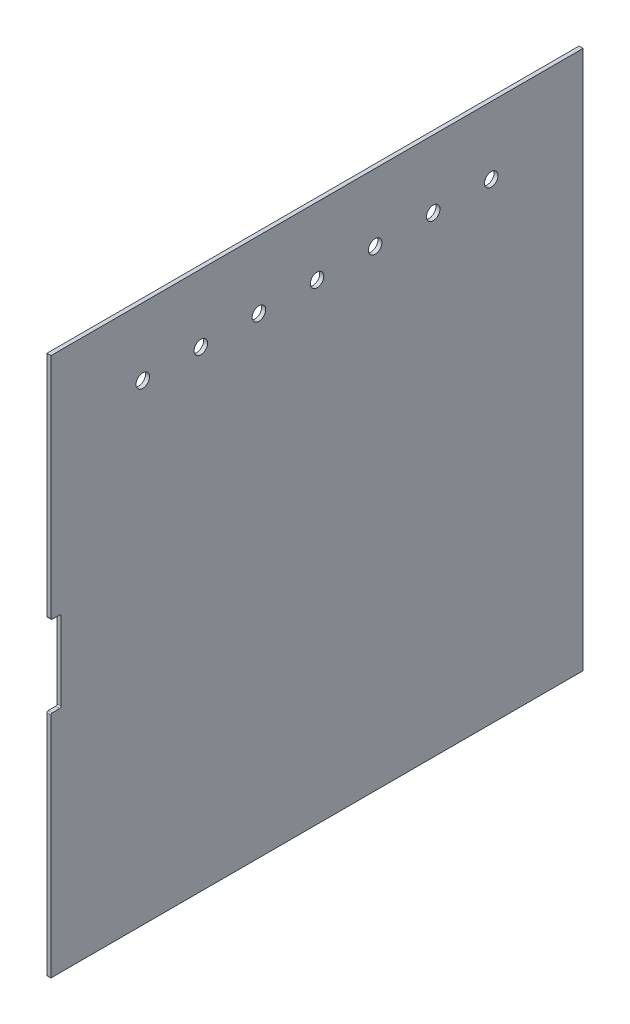
ISO-10303-21;
HEADER;
FILE_DESCRIPTION(('STEP AP214'),'2;1');
FILE_NAME('part.step','',(''),(''),'','','');
FILE_SCHEMA(('AUTOMOTIVE_DESIGN { 1 0 10303 214 1 1 1 1 }'));
ENDSEC;
DATA;
#1=APPLICATION_CONTEXT('core data for automotive mechanical design processes');
#2=APPLICATION_PROTOCOL_DEFINITION('international standard','automotive_design',2000,#1);
#3=PRODUCT_CONTEXT('',#1,'mechanical');
#4=PRODUCT('Part','Part','',(#3));
#5=PRODUCT_RELATED_PRODUCT_CATEGORY('part','',(#4));
#6=PRODUCT_DEFINITION_FORMATION('','',#4);
#7=PRODUCT_DEFINITION_CONTEXT('part definition',#1,'design');
#8=PRODUCT_DEFINITION('design','',#6,#7);
#9=PRODUCT_DEFINITION_SHAPE('','',#8);
#10=(LENGTH_UNIT() NAMED_UNIT(*) SI_UNIT(.MILLI.,.METRE.));
#11=(NAMED_UNIT(*) PLANE_ANGLE_UNIT() SI_UNIT($,.RADIAN.));
#12=(NAMED_UNIT(*) SI_UNIT($,.STERADIAN.) SOLID_ANGLE_UNIT());
#13=UNCERTAINTY_MEASURE_WITH_UNIT(LENGTH_MEASURE(1.E-05),#10,'distance_accuracy_value','');
#14=(GEOMETRIC_REPRESENTATION_CONTEXT(3) GLOBAL_UNCERTAINTY_ASSIGNED_CONTEXT((#13)) GLOBAL_UNIT_ASSIGNED_CONTEXT((#10,
#11,#12)) REPRESENTATION_CONTEXT('',''));
#15=CARTESIAN_POINT('',(0.,0.,0.));
#16=DIRECTION('',(0.,0.,1.));
#17=DIRECTION('',(1.,0.,0.));
#18=AXIS2_PLACEMENT_3D('',#15,#16,#17);
#19=CARTESIAN_POINT('',(3.,199.5,197.));
#20=DIRECTION('',(0.,0.,-1.));
#21=DIRECTION('',(0.,1.,0.));
#22=AXIS2_PLACEMENT_3D('',#19,#20,#21);
#23=PLANE('',#22);
#24=DIRECTION('',(0.,-1.,0.));
#25=VECTOR('',#24,1.);
#26=CARTESIAN_POINT('',(0.,199.5,197.));
#27=LINE('',#26,#25);
#28=CARTESIAN_POINT('',(0.,199.5,197.));
#29=VERTEX_POINT('',#28);
#30=CARTESIAN_POINT('',(0.,31.,197.));
#31=VERTEX_POINT('',#30);
#32=EDGE_CURVE('E313',#29,#31,#27,.T.);
#33=ORIENTED_EDGE('',*,*,#32,.T.);
#34=DIRECTION('',(1.,0.,0.));
#35=VECTOR('',#34,1.);
#36=CARTESIAN_POINT('',(3.,31.,197.));
#37=LINE('',#36,#35);
#38=CARTESIAN_POINT('',(3.,31.,197.));
#39=VERTEX_POINT('',#38);
#40=EDGE_CURVE('E195',#31,#39,#37,.T.);
#41=ORIENTED_EDGE('',*,*,#40,.T.);
#42=DIRECTION('',(0.,-1.,0.));
#43=VECTOR('',#42,1.);
#44=CARTESIAN_POINT('',(3.,199.5,197.));
#45=LINE('',#44,#43);
#46=CARTESIAN_POINT('',(3.,199.5,197.));
#47=VERTEX_POINT('',#46);
#48=EDGE_CURVE('E304',#47,#39,#45,.T.);
#49=ORIENTED_EDGE('',*,*,#48,.F.);
#50=DIRECTION('',(-1.,0.,0.));
#51=VECTOR('',#50,1.);
#52=CARTESIAN_POINT('',(3.,199.5,197.));
#53=LINE('',#52,#51);
#54=EDGE_CURVE('E137',#47,#29,#53,.T.);
#55=ORIENTED_EDGE('',*,*,#54,.T.);
#56=EDGE_LOOP('',(#33,#41,#49,#55));
#57=FACE_BOUND('',#56,.T.);
#58=ADVANCED_FACE('F38',(#57),#23,.F.);
#59=CARTESIAN_POINT('',(3.,199.5,-197.));
#60=DIRECTION('',(0.,0.,1.));
#61=DIRECTION('',(0.,-1.,0.));
#62=AXIS2_PLACEMENT_3D('',#59,#60,#61);
#63=PLANE('',#62);
#64=DIRECTION('',(0.,1.,0.));
#65=VECTOR('',#64,1.);
#66=CARTESIAN_POINT('',(0.,199.5,-197.));
#67=LINE('',#66,#65);
#68=CARTESIAN_POINT('',(0.,-199.5,-197.));
#69=VERTEX_POINT('',#68);
#70=CARTESIAN_POINT('',(0.,199.5,-197.));
#71=VERTEX_POINT('',#70);
#72=EDGE_CURVE('E159',#69,#71,#67,.T.);
#73=ORIENTED_EDGE('',*,*,#72,.T.);
#74=DIRECTION('',(-1.,0.,0.));
#75=VECTOR('',#74,1.);
#76=CARTESIAN_POINT('',(3.,199.5,-197.));
#77=LINE('',#76,#75);
#78=CARTESIAN_POINT('',(3.,199.5,-197.));
#79=VERTEX_POINT('',#78);
#80=EDGE_CURVE('E134',#79,#71,#77,.T.);
#81=ORIENTED_EDGE('',*,*,#80,.F.);
#82=DIRECTION('',(0.,1.,0.));
#83=VECTOR('',#82,1.);
#84=CARTESIAN_POINT('',(3.,199.5,-197.));
#85=LINE('',#84,#83);
#86=CARTESIAN_POINT('',(3.,-199.5,-197.));
#87=VERTEX_POINT('',#86);
#88=EDGE_CURVE('E143',#87,#79,#85,.T.);
#89=ORIENTED_EDGE('',*,*,#88,.F.);
#90=DIRECTION('',(-1.,0.,0.));
#91=VECTOR('',#90,1.);
#92=CARTESIAN_POINT('',(3.,-199.5,-197.));
#93=LINE('',#92,#91);
#94=EDGE_CURVE('E308',#87,#69,#93,.T.);
#95=ORIENTED_EDGE('',*,*,#94,.T.);
#96=EDGE_LOOP('',(#73,#81,#89,#95));
#97=FACE_BOUND('',#96,.T.);
#98=ADVANCED_FACE('F157',(#97),#63,.F.);
#99=CARTESIAN_POINT('',(3.,199.5,197.));
#100=DIRECTION('',(0.,-1.,0.));
#101=DIRECTION('',(0.,0.,-1.));
#102=AXIS2_PLACEMENT_3D('',#99,#100,#101);
#103=PLANE('',#102);
#104=DIRECTION('',(0.,0.,1.));
#105=VECTOR('',#104,1.);
#106=CARTESIAN_POINT('',(0.,199.5,197.));
#107=LINE('',#106,#105);
#108=EDGE_CURVE('E237',#71,#29,#107,.T.);
#109=ORIENTED_EDGE('',*,*,#108,.T.);
#110=ORIENTED_EDGE('',*,*,#54,.F.);
#111=DIRECTION('',(0.,0.,1.));
#112=VECTOR('',#111,1.);
#113=CARTESIAN_POINT('',(3.,199.5,197.));
#114=LINE('',#113,#112);
#115=EDGE_CURVE('E130',#79,#47,#114,.T.);
#116=ORIENTED_EDGE('',*,*,#115,.F.);
#117=ORIENTED_EDGE('',*,*,#80,.T.);
#118=EDGE_LOOP('',(#109,#110,#116,#117));
#119=FACE_BOUND('',#118,.T.);
#120=ADVANCED_FACE('F132',(#119),#103,.F.);
#121=CARTESIAN_POINT('',(3.,-31.,197.));
#122=VERTEX_POINT('',#121);
#123=CARTESIAN_POINT('',(3.,-199.5,197.));
#124=VERTEX_POINT('',#123);
#125=EDGE_CURVE('E142',#122,#124,#45,.T.);
#126=ORIENTED_EDGE('',*,*,#125,.F.);
#127=DIRECTION('',(1.,0.,0.));
#128=VECTOR('',#127,1.);
#129=CARTESIAN_POINT('',(3.,-31.,197.));
#130=LINE('',#129,#128);
#131=CARTESIAN_POINT('',(0.,-31.,197.));
#132=VERTEX_POINT('',#131);
#133=EDGE_CURVE('E180',#122,#132,#130,.F.);
#134=ORIENTED_EDGE('',*,*,#133,.T.);
#135=CARTESIAN_POINT('',(0.,-199.5,197.));
#136=VERTEX_POINT('',#135);
#137=EDGE_CURVE('E312',#132,#136,#27,.T.);
#138=ORIENTED_EDGE('',*,*,#137,.T.);
#139=DIRECTION('',(-1.,0.,0.));
#140=VECTOR('',#139,1.);
#141=CARTESIAN_POINT('',(3.,-199.5,197.));
#142=LINE('',#141,#140);
#143=EDGE_CURVE('E167',#124,#136,#142,.T.);
#144=ORIENTED_EDGE('',*,*,#143,.F.);
#145=EDGE_LOOP('',(#126,#134,#138,#144));
#146=FACE_BOUND('',#145,.T.);
#147=ADVANCED_FACE('F343',(#146),#23,.F.);
#148=CARTESIAN_POINT('',(3.,-199.5,197.));
#149=DIRECTION('',(0.,1.,0.));
#150=DIRECTION('',(0.,0.,1.));
#151=AXIS2_PLACEMENT_3D('',#148,#149,#150);
#152=PLANE('',#151);
#153=DIRECTION('',(0.,0.,-1.));
#154=VECTOR('',#153,1.);
#155=CARTESIAN_POINT('',(0.,-199.5,197.));
#156=LINE('',#155,#154);
#157=EDGE_CURVE('E155',#136,#69,#156,.T.);
#158=ORIENTED_EDGE('',*,*,#157,.T.);
#159=ORIENTED_EDGE('',*,*,#94,.F.);
#160=DIRECTION('',(0.,0.,-1.));
#161=VECTOR('',#160,1.);
#162=CARTESIAN_POINT('',(3.,-199.5,197.));
#163=LINE('',#162,#161);
#164=EDGE_CURVE('E150',#124,#87,#163,.T.);
#165=ORIENTED_EDGE('',*,*,#164,.F.);
#166=ORIENTED_EDGE('',*,*,#143,.T.);
#167=EDGE_LOOP('',(#158,#159,#165,#166));
#168=FACE_BOUND('',#167,.T.);
#169=ADVANCED_FACE('F324',(#168),#152,.F.);
#170=CARTESIAN_POINT('',(3.,0.,0.));
#171=DIRECTION('',(1.,0.,0.));
#172=DIRECTION('',(0.,0.,-1.));
#173=AXIS2_PLACEMENT_3D('',#170,#171,#172);
#174=PLANE('',#173);
#175=DIRECTION('',(0.,0.,-1.));
#176=VECTOR('',#175,1.);
#177=CARTESIAN_POINT('',(3.,-30.,197.));
#178=LINE('',#177,#176);
#179=CARTESIAN_POINT('',(3.,-30.,196.));
#180=VERTEX_POINT('',#179);
#181=CARTESIAN_POINT('',(3.,-30.,190.5));
#182=VERTEX_POINT('',#181);
#183=EDGE_CURVE('E225',#180,#182,#178,.T.);
#184=ORIENTED_EDGE('',*,*,#183,.F.);
#185=CARTESIAN_POINT('',(3.,-31.,196.));
#186=DIRECTION('',(1.,0.,0.));
#187=DIRECTION('',(0.,0.,-1.));
#188=AXIS2_PLACEMENT_3D('',#185,#186,#187);
#189=CIRCLE('',#188,1.);
#190=EDGE_CURVE('E177',#180,#122,#189,.T.);
#191=ORIENTED_EDGE('',*,*,#190,.T.);
#192=ORIENTED_EDGE('',*,*,#125,.T.);
#193=ORIENTED_EDGE('',*,*,#164,.T.);
#194=ORIENTED_EDGE('',*,*,#88,.T.);
#195=ORIENTED_EDGE('',*,*,#115,.T.);
#196=ORIENTED_EDGE('',*,*,#48,.T.);
#197=CARTESIAN_POINT('',(3.,31.,196.));
#198=DIRECTION('',(1.,0.,0.));
#199=DIRECTION('',(0.,0.,-1.));
#200=AXIS2_PLACEMENT_3D('',#197,#198,#199);
#201=CIRCLE('',#200,1.);
#202=CARTESIAN_POINT('',(3.,30.,196.));
#203=VERTEX_POINT('',#202);
#204=EDGE_CURVE('E174',#39,#203,#201,.T.);
#205=ORIENTED_EDGE('',*,*,#204,.T.);
#206=DIRECTION('',(0.,0.,1.));
#207=VECTOR('',#206,1.);
#208=CARTESIAN_POINT('',(3.,30.,197.));
#209=LINE('',#208,#207);
#210=CARTESIAN_POINT('',(3.,30.,190.5));
#211=VERTEX_POINT('',#210);
#212=EDGE_CURVE('E215',#211,#203,#209,.T.);
#213=ORIENTED_EDGE('',*,*,#212,.F.);
#214=CARTESIAN_POINT('',(3.,29.,190.5));
#215=DIRECTION('',(1.,0.,0.));
#216=DIRECTION('',(0.,0.,-1.));
#217=AXIS2_PLACEMENT_3D('',#214,#215,#216);
#218=CIRCLE('',#217,1.);
#219=CARTESIAN_POINT('',(3.,29.,189.5));
#220=VERTEX_POINT('',#219);
#221=EDGE_CURVE('E47',#211,#220,#218,.F.);
#222=ORIENTED_EDGE('',*,*,#221,.T.);
#223=DIRECTION('',(0.,1.,0.));
#224=VECTOR('',#223,1.);
#225=CARTESIAN_POINT('',(3.,30.,189.5));
#226=LINE('',#225,#224);
#227=CARTESIAN_POINT('',(3.,-29.,189.5));
#228=VERTEX_POINT('',#227);
#229=EDGE_CURVE('E214',#228,#220,#226,.T.);
#230=ORIENTED_EDGE('',*,*,#229,.F.);
#231=CARTESIAN_POINT('',(3.,-29.,190.5));
#232=DIRECTION('',(1.,0.,0.));
#233=DIRECTION('',(0.,0.,-1.));
#234=AXIS2_PLACEMENT_3D('',#231,#232,#233);
#235=CIRCLE('',#234,1.);
#236=EDGE_CURVE('E205',#228,#182,#235,.F.);
#237=ORIENTED_EDGE('',*,*,#236,.T.);
#238=EDGE_LOOP('',(#184,#191,#192,#193,#194,#195,#196,#205,#213,#222,#230,#237));
#239=FACE_BOUND('',#238,.T.);
#240=CARTESIAN_POINT('',(3.,149.5,129.));
#241=DIRECTION('',(1.,0.,0.));
#242=DIRECTION('',(0.,0.,-1.));
#243=AXIS2_PLACEMENT_3D('',#240,#241,#242);
#244=CIRCLE('',#243,4.99999999999999);
#245=CARTESIAN_POINT('',(3.,149.5,124.));
#246=VERTEX_POINT('',#245);
#247=EDGE_CURVE('E252',#246,#246,#244,.T.);
#248=ORIENTED_EDGE('',*,*,#247,.F.);
#249=EDGE_LOOP('',(#248));
#250=FACE_BOUND('',#249,.T.);
#251=CARTESIAN_POINT('',(3.,149.5,86.));
#252=DIRECTION('',(1.,0.,0.));
#253=DIRECTION('',(0.,0.,-1.));
#254=AXIS2_PLACEMENT_3D('',#251,#252,#253);
#255=CIRCLE('',#254,4.99999999999999);
#256=CARTESIAN_POINT('',(3.,149.5,81.));
#257=VERTEX_POINT('',#256);
#258=EDGE_CURVE('E260',#257,#257,#255,.T.);
#259=ORIENTED_EDGE('',*,*,#258,.F.);
#260=EDGE_LOOP('',(#259));
#261=FACE_BOUND('',#260,.T.);
#262=CARTESIAN_POINT('',(3.,149.5,43.));
#263=DIRECTION('',(1.,0.,0.));
#264=DIRECTION('',(0.,0.,-1.));
#265=AXIS2_PLACEMENT_3D('',#262,#263,#264);
#266=CIRCLE('',#265,4.99999999999999);
#267=CARTESIAN_POINT('',(3.,149.5,38.));
#268=VERTEX_POINT('',#267);
#269=EDGE_CURVE('E268',#268,#268,#266,.T.);
#270=ORIENTED_EDGE('',*,*,#269,.F.);
#271=EDGE_LOOP('',(#270));
#272=FACE_BOUND('',#271,.T.);
#273=CARTESIAN_POINT('',(3.,149.5,0.));
#274=DIRECTION('',(1.,0.,0.));
#275=DIRECTION('',(0.,0.,-1.));
#276=AXIS2_PLACEMENT_3D('',#273,#274,#275);
#277=CIRCLE('',#276,4.99999999999999);
#278=CARTESIAN_POINT('',(3.,149.5,-4.99999999999999));
#279=VERTEX_POINT('',#278);
#280=EDGE_CURVE('E276',#279,#279,#277,.T.);
#281=ORIENTED_EDGE('',*,*,#280,.F.);
#282=EDGE_LOOP('',(#281));
#283=FACE_BOUND('',#282,.T.);
#284=CARTESIAN_POINT('',(3.,149.5,-43.));
#285=DIRECTION('',(1.,0.,0.));
#286=DIRECTION('',(0.,0.,-1.));
#287=AXIS2_PLACEMENT_3D('',#284,#285,#286);
#288=CIRCLE('',#287,4.99999999999999);
#289=CARTESIAN_POINT('',(3.,149.5,-48.));
#290=VERTEX_POINT('',#289);
#291=EDGE_CURVE('E284',#290,#290,#288,.T.);
#292=ORIENTED_EDGE('',*,*,#291,.F.);
#293=EDGE_LOOP('',(#292));
#294=FACE_BOUND('',#293,.T.);
#295=CARTESIAN_POINT('',(3.,149.5,-86.));
#296=DIRECTION('',(1.,0.,0.));
#297=DIRECTION('',(0.,0.,-1.));
#298=AXIS2_PLACEMENT_3D('',#295,#296,#297);
#299=CIRCLE('',#298,4.99999999999999);
#300=CARTESIAN_POINT('',(3.,149.5,-91.));
#301=VERTEX_POINT('',#300);
#302=EDGE_CURVE('E292',#301,#301,#299,.T.);
#303=ORIENTED_EDGE('',*,*,#302,.F.);
#304=EDGE_LOOP('',(#303));
#305=FACE_BOUND('',#304,.T.);
#306=CARTESIAN_POINT('',(3.,149.5,-129.));
#307=DIRECTION('',(1.,0.,0.));
#308=DIRECTION('',(0.,0.,-1.));
#309=AXIS2_PLACEMENT_3D('',#306,#307,#308);
#310=CIRCLE('',#309,4.99999999999999);
#311=CARTESIAN_POINT('',(3.,149.5,-134.));
#312=VERTEX_POINT('',#311);
#313=EDGE_CURVE('E300',#312,#312,#310,.T.);
#314=ORIENTED_EDGE('',*,*,#313,.F.);
#315=EDGE_LOOP('',(#314));
#316=FACE_BOUND('',#315,.T.);
#317=ADVANCED_FACE('F147',(#239,#250,#261,#272,#283,#294,#305,#316),#174,.T.);
#318=CARTESIAN_POINT('',(0.,0.,0.));
#319=DIRECTION('',(1.,0.,0.));
#320=DIRECTION('',(0.,0.,-1.));
#321=AXIS2_PLACEMENT_3D('',#318,#319,#320);
#322=PLANE('',#321);
#323=CARTESIAN_POINT('',(0.,149.5,129.));
#324=DIRECTION('',(1.,0.,0.));
#325=DIRECTION('',(0.,0.,-1.));
#326=AXIS2_PLACEMENT_3D('',#323,#324,#325);
#327=CIRCLE('',#326,4.99999999999999);
#328=CARTESIAN_POINT('',(0.,149.5,124.));
#329=VERTEX_POINT('',#328);
#330=EDGE_CURVE('E245',#329,#329,#327,.T.);
#331=ORIENTED_EDGE('',*,*,#330,.T.);
#332=EDGE_LOOP('',(#331));
#333=FACE_BOUND('',#332,.T.);
#334=CARTESIAN_POINT('',(0.,149.5,86.));
#335=DIRECTION('',(1.,0.,0.));
#336=DIRECTION('',(0.,0.,-1.));
#337=AXIS2_PLACEMENT_3D('',#334,#335,#336);
#338=CIRCLE('',#337,4.99999999999999);
#339=CARTESIAN_POINT('',(0.,149.5,81.));
#340=VERTEX_POINT('',#339);
#341=EDGE_CURVE('E256',#340,#340,#338,.T.);
#342=ORIENTED_EDGE('',*,*,#341,.T.);
#343=EDGE_LOOP('',(#342));
#344=FACE_BOUND('',#343,.T.);
#345=CARTESIAN_POINT('',(0.,149.5,43.));
#346=DIRECTION('',(1.,0.,0.));
#347=DIRECTION('',(0.,0.,-1.));
#348=AXIS2_PLACEMENT_3D('',#345,#346,#347);
#349=CIRCLE('',#348,4.99999999999999);
#350=CARTESIAN_POINT('',(0.,149.5,38.));
#351=VERTEX_POINT('',#350);
#352=EDGE_CURVE('E264',#351,#351,#349,.T.);
#353=ORIENTED_EDGE('',*,*,#352,.T.);
#354=EDGE_LOOP('',(#353));
#355=FACE_BOUND('',#354,.T.);
#356=CARTESIAN_POINT('',(0.,149.5,0.));
#357=DIRECTION('',(1.,0.,0.));
#358=DIRECTION('',(0.,0.,-1.));
#359=AXIS2_PLACEMENT_3D('',#356,#357,#358);
#360=CIRCLE('',#359,4.99999999999999);
#361=CARTESIAN_POINT('',(0.,149.5,-4.99999999999999));
#362=VERTEX_POINT('',#361);
#363=EDGE_CURVE('E272',#362,#362,#360,.T.);
#364=ORIENTED_EDGE('',*,*,#363,.T.);
#365=EDGE_LOOP('',(#364));
#366=FACE_BOUND('',#365,.T.);
#367=CARTESIAN_POINT('',(0.,149.5,-43.));
#368=DIRECTION('',(1.,0.,0.));
#369=DIRECTION('',(0.,0.,-1.));
#370=AXIS2_PLACEMENT_3D('',#367,#368,#369);
#371=CIRCLE('',#370,4.99999999999999);
#372=CARTESIAN_POINT('',(0.,149.5,-48.));
#373=VERTEX_POINT('',#372);
#374=EDGE_CURVE('E280',#373,#373,#371,.T.);
#375=ORIENTED_EDGE('',*,*,#374,.T.);
#376=EDGE_LOOP('',(#375));
#377=FACE_BOUND('',#376,.T.);
#378=CARTESIAN_POINT('',(0.,149.5,-86.));
#379=DIRECTION('',(1.,0.,0.));
#380=DIRECTION('',(0.,0.,-1.));
#381=AXIS2_PLACEMENT_3D('',#378,#379,#380);
#382=CIRCLE('',#381,4.99999999999999);
#383=CARTESIAN_POINT('',(0.,149.5,-91.));
#384=VERTEX_POINT('',#383);
#385=EDGE_CURVE('E288',#384,#384,#382,.T.);
#386=ORIENTED_EDGE('',*,*,#385,.T.);
#387=EDGE_LOOP('',(#386));
#388=FACE_BOUND('',#387,.T.);
#389=CARTESIAN_POINT('',(0.,149.5,-129.));
#390=DIRECTION('',(1.,0.,0.));
#391=DIRECTION('',(0.,0.,-1.));
#392=AXIS2_PLACEMENT_3D('',#389,#390,#391);
#393=CIRCLE('',#392,4.99999999999999);
#394=CARTESIAN_POINT('',(0.,149.5,-134.));
#395=VERTEX_POINT('',#394);
#396=EDGE_CURVE('E296',#395,#395,#393,.T.);
#397=ORIENTED_EDGE('',*,*,#396,.T.);
#398=EDGE_LOOP('',(#397));
#399=FACE_BOUND('',#398,.T.);
#400=ORIENTED_EDGE('',*,*,#137,.F.);
#401=CARTESIAN_POINT('',(0.,-31.,196.));
#402=DIRECTION('',(1.,0.,0.));
#403=DIRECTION('',(0.,0.,-1.));
#404=AXIS2_PLACEMENT_3D('',#401,#402,#403);
#405=CIRCLE('',#404,1.);
#406=CARTESIAN_POINT('',(0.,-30.,196.));
#407=VERTEX_POINT('',#406);
#408=EDGE_CURVE('E185',#132,#407,#405,.F.);
#409=ORIENTED_EDGE('',*,*,#408,.T.);
#410=DIRECTION('',(0.,0.,-1.));
#411=VECTOR('',#410,1.);
#412=CARTESIAN_POINT('',(0.,-30.,197.));
#413=LINE('',#412,#411);
#414=CARTESIAN_POINT('',(0.,-30.,190.5));
#415=VERTEX_POINT('',#414);
#416=EDGE_CURVE('E239',#407,#415,#413,.T.);
#417=ORIENTED_EDGE('',*,*,#416,.T.);
#418=CARTESIAN_POINT('',(0.,-29.,190.5));
#419=DIRECTION('',(1.,0.,0.));
#420=DIRECTION('',(0.,0.,-1.));
#421=AXIS2_PLACEMENT_3D('',#418,#419,#420);
#422=CIRCLE('',#421,1.);
#423=CARTESIAN_POINT('',(0.,-29.,189.5));
#424=VERTEX_POINT('',#423);
#425=EDGE_CURVE('E208',#415,#424,#422,.T.);
#426=ORIENTED_EDGE('',*,*,#425,.T.);
#427=DIRECTION('',(0.,1.,0.));
#428=VECTOR('',#427,1.);
#429=CARTESIAN_POINT('',(0.,30.,189.5));
#430=LINE('',#429,#428);
#431=CARTESIAN_POINT('',(0.,29.,189.5));
#432=VERTEX_POINT('',#431);
#433=EDGE_CURVE('E231',#424,#432,#430,.T.);
#434=ORIENTED_EDGE('',*,*,#433,.T.);
#435=CARTESIAN_POINT('',(0.,29.,190.5));
#436=DIRECTION('',(1.,0.,0.));
#437=DIRECTION('',(0.,0.,-1.));
#438=AXIS2_PLACEMENT_3D('',#435,#436,#437);
#439=CIRCLE('',#438,1.);
#440=CARTESIAN_POINT('',(0.,30.,190.5));
#441=VERTEX_POINT('',#440);
#442=EDGE_CURVE('E11',#432,#441,#439,.T.);
#443=ORIENTED_EDGE('',*,*,#442,.T.);
#444=DIRECTION('',(0.,0.,1.));
#445=VECTOR('',#444,1.);
#446=CARTESIAN_POINT('',(0.,30.,197.));
#447=LINE('',#446,#445);
#448=CARTESIAN_POINT('',(0.,30.,196.));
#449=VERTEX_POINT('',#448);
#450=EDGE_CURVE('E230',#441,#449,#447,.T.);
#451=ORIENTED_EDGE('',*,*,#450,.T.);
#452=CARTESIAN_POINT('',(0.,31.,196.));
#453=DIRECTION('',(1.,0.,0.));
#454=DIRECTION('',(0.,0.,-1.));
#455=AXIS2_PLACEMENT_3D('',#452,#453,#454);
#456=CIRCLE('',#455,1.);
#457=EDGE_CURVE('E54',#449,#31,#456,.F.);
#458=ORIENTED_EDGE('',*,*,#457,.T.);
#459=ORIENTED_EDGE('',*,*,#32,.F.);
#460=ORIENTED_EDGE('',*,*,#108,.F.);
#461=ORIENTED_EDGE('',*,*,#72,.F.);
#462=ORIENTED_EDGE('',*,*,#157,.F.);
#463=EDGE_LOOP('',(#400,#409,#417,#426,#434,#443,#451,#458,#459,#460,#461,#462));
#464=FACE_BOUND('',#463,.T.);
#465=ADVANCED_FACE('F229',(#333,#344,#355,#366,#377,#388,#399,#464),#322,.F.);
#466=CARTESIAN_POINT('',(0.,149.5,-129.));
#467=DIRECTION('',(1.,0.,0.));
#468=DIRECTION('',(0.,0.,-1.));
#469=AXIS2_PLACEMENT_3D('',#466,#467,#468);
#470=CYLINDRICAL_SURFACE('',#469,4.99999999999999);
#471=ORIENTED_EDGE('',*,*,#396,.F.);
#472=EDGE_LOOP('',(#471));
#473=FACE_BOUND('',#472,.T.);
#474=ORIENTED_EDGE('',*,*,#313,.T.);
#475=EDGE_LOOP('',(#474));
#476=FACE_BOUND('',#475,.T.);
#477=ADVANCED_FACE('F402',(#473,#476),#470,.F.);
#478=CARTESIAN_POINT('',(0.,149.5,-86.));
#479=DIRECTION('',(1.,0.,0.));
#480=DIRECTION('',(0.,0.,-1.));
#481=AXIS2_PLACEMENT_3D('',#478,#479,#480);
#482=CYLINDRICAL_SURFACE('',#481,4.99999999999999);
#483=ORIENTED_EDGE('',*,*,#385,.F.);
#484=EDGE_LOOP('',(#483));
#485=FACE_BOUND('',#484,.T.);
#486=ORIENTED_EDGE('',*,*,#302,.T.);
#487=EDGE_LOOP('',(#486));
#488=FACE_BOUND('',#487,.T.);
#489=ADVANCED_FACE('F398',(#485,#488),#482,.F.);
#490=CARTESIAN_POINT('',(0.,149.5,-43.));
#491=DIRECTION('',(1.,0.,0.));
#492=DIRECTION('',(0.,0.,-1.));
#493=AXIS2_PLACEMENT_3D('',#490,#491,#492);
#494=CYLINDRICAL_SURFACE('',#493,4.99999999999999);
#495=ORIENTED_EDGE('',*,*,#374,.F.);
#496=EDGE_LOOP('',(#495));
#497=FACE_BOUND('',#496,.T.);
#498=ORIENTED_EDGE('',*,*,#291,.T.);
#499=EDGE_LOOP('',(#498));
#500=FACE_BOUND('',#499,.T.);
#501=ADVANCED_FACE('F394',(#497,#500),#494,.F.);
#502=CARTESIAN_POINT('',(0.,149.5,0.));
#503=DIRECTION('',(1.,0.,0.));
#504=DIRECTION('',(0.,0.,-1.));
#505=AXIS2_PLACEMENT_3D('',#502,#503,#504);
#506=CYLINDRICAL_SURFACE('',#505,4.99999999999999);
#507=ORIENTED_EDGE('',*,*,#363,.F.);
#508=EDGE_LOOP('',(#507));
#509=FACE_BOUND('',#508,.T.);
#510=ORIENTED_EDGE('',*,*,#280,.T.);
#511=EDGE_LOOP('',(#510));
#512=FACE_BOUND('',#511,.T.);
#513=ADVANCED_FACE('F390',(#509,#512),#506,.F.);
#514=CARTESIAN_POINT('',(0.,149.5,43.));
#515=DIRECTION('',(1.,0.,0.));
#516=DIRECTION('',(0.,0.,-1.));
#517=AXIS2_PLACEMENT_3D('',#514,#515,#516);
#518=CYLINDRICAL_SURFACE('',#517,4.99999999999999);
#519=ORIENTED_EDGE('',*,*,#352,.F.);
#520=EDGE_LOOP('',(#519));
#521=FACE_BOUND('',#520,.T.);
#522=ORIENTED_EDGE('',*,*,#269,.T.);
#523=EDGE_LOOP('',(#522));
#524=FACE_BOUND('',#523,.T.);
#525=ADVANCED_FACE('F386',(#521,#524),#518,.F.);
#526=CARTESIAN_POINT('',(0.,149.5,86.));
#527=DIRECTION('',(1.,0.,0.));
#528=DIRECTION('',(0.,0.,-1.));
#529=AXIS2_PLACEMENT_3D('',#526,#527,#528);
#530=CYLINDRICAL_SURFACE('',#529,4.99999999999999);
#531=ORIENTED_EDGE('',*,*,#341,.F.);
#532=EDGE_LOOP('',(#531));
#533=FACE_BOUND('',#532,.T.);
#534=ORIENTED_EDGE('',*,*,#258,.T.);
#535=EDGE_LOOP('',(#534));
#536=FACE_BOUND('',#535,.T.);
#537=ADVANCED_FACE('F382',(#533,#536),#530,.F.);
#538=CARTESIAN_POINT('',(0.,149.5,129.));
#539=DIRECTION('',(1.,0.,0.));
#540=DIRECTION('',(0.,0.,-1.));
#541=AXIS2_PLACEMENT_3D('',#538,#539,#540);
#542=CYLINDRICAL_SURFACE('',#541,4.99999999999999);
#543=ORIENTED_EDGE('',*,*,#330,.F.);
#544=EDGE_LOOP('',(#543));
#545=FACE_BOUND('',#544,.T.);
#546=ORIENTED_EDGE('',*,*,#247,.T.);
#547=EDGE_LOOP('',(#546));
#548=FACE_BOUND('',#547,.T.);
#549=ADVANCED_FACE('F379',(#545,#548),#542,.F.);
#550=CARTESIAN_POINT('',(0.,30.,197.));
#551=DIRECTION('',(0.,1.,0.));
#552=DIRECTION('',(0.,0.,1.));
#553=AXIS2_PLACEMENT_3D('',#550,#551,#552);
#554=PLANE('',#553);
#555=ORIENTED_EDGE('',*,*,#212,.T.);
#556=DIRECTION('',(1.,0.,0.));
#557=VECTOR('',#556,1.);
#558=CARTESIAN_POINT('',(0.,30.,196.));
#559=LINE('',#558,#557);
#560=EDGE_CURVE('E62',#203,#449,#559,.F.);
#561=ORIENTED_EDGE('',*,*,#560,.T.);
#562=ORIENTED_EDGE('',*,*,#450,.F.);
#563=DIRECTION('',(1.,0.,0.));
#564=VECTOR('',#563,1.);
#565=CARTESIAN_POINT('',(3.,30.,190.5));
#566=LINE('',#565,#564);
#567=EDGE_CURVE('E199',#441,#211,#566,.T.);
#568=ORIENTED_EDGE('',*,*,#567,.T.);
#569=EDGE_LOOP('',(#555,#561,#562,#568));
#570=FACE_BOUND('',#569,.T.);
#571=ADVANCED_FACE('F232',(#570),#554,.F.);
#572=CARTESIAN_POINT('',(0.,30.,189.5));
#573=DIRECTION('',(0.,0.,-1.));
#574=DIRECTION('',(-1.,0.,0.));
#575=AXIS2_PLACEMENT_3D('',#572,#573,#574);
#576=PLANE('',#575);
#577=ORIENTED_EDGE('',*,*,#433,.F.);
#578=DIRECTION('',(1.,0.,0.));
#579=VECTOR('',#578,1.);
#580=CARTESIAN_POINT('',(3.,-29.,189.5));
#581=LINE('',#580,#579);
#582=EDGE_CURVE('E191',#424,#228,#581,.T.);
#583=ORIENTED_EDGE('',*,*,#582,.T.);
#584=ORIENTED_EDGE('',*,*,#229,.T.);
#585=DIRECTION('',(1.,0.,0.));
#586=VECTOR('',#585,1.);
#587=CARTESIAN_POINT('',(0.,29.,189.5));
#588=LINE('',#587,#586);
#589=EDGE_CURVE('E188',#220,#432,#588,.F.);
#590=ORIENTED_EDGE('',*,*,#589,.T.);
#591=EDGE_LOOP('',(#577,#583,#584,#590));
#592=FACE_BOUND('',#591,.T.);
#593=ADVANCED_FACE('F221',(#592),#576,.F.);
#594=CARTESIAN_POINT('',(0.,-30.,197.));
#595=DIRECTION('',(0.,-1.,0.));
#596=DIRECTION('',(0.,0.,-1.));
#597=AXIS2_PLACEMENT_3D('',#594,#595,#596);
#598=PLANE('',#597);
#599=ORIENTED_EDGE('',*,*,#416,.F.);
#600=DIRECTION('',(1.,0.,0.));
#601=VECTOR('',#600,1.);
#602=CARTESIAN_POINT('',(0.,-30.,196.));
#603=LINE('',#602,#601);
#604=EDGE_CURVE('E165',#407,#180,#603,.T.);
#605=ORIENTED_EDGE('',*,*,#604,.T.);
#606=ORIENTED_EDGE('',*,*,#183,.T.);
#607=DIRECTION('',(1.,0.,0.));
#608=VECTOR('',#607,1.);
#609=CARTESIAN_POINT('',(0.,-30.,190.5));
#610=LINE('',#609,#608);
#611=EDGE_CURVE('E161',#182,#415,#610,.F.);
#612=ORIENTED_EDGE('',*,*,#611,.T.);
#613=EDGE_LOOP('',(#599,#605,#606,#612));
#614=FACE_BOUND('',#613,.T.);
#615=ADVANCED_FACE('F365',(#614),#598,.F.);
#616=CARTESIAN_POINT('',(0.,-31.,196.));
#617=DIRECTION('',(1.,0.,0.));
#618=DIRECTION('',(0.,0.,-1.));
#619=AXIS2_PLACEMENT_3D('',#616,#617,#618);
#620=CYLINDRICAL_SURFACE('',#619,1.);
#621=ORIENTED_EDGE('',*,*,#408,.F.);
#622=ORIENTED_EDGE('',*,*,#133,.F.);
#623=ORIENTED_EDGE('',*,*,#190,.F.);
#624=ORIENTED_EDGE('',*,*,#604,.F.);
#625=EDGE_LOOP('',(#621,#622,#623,#624));
#626=FACE_BOUND('',#625,.T.);
#627=ADVANCED_FACE('F338',(#626),#620,.T.);
#628=CARTESIAN_POINT('',(0.,-29.,190.5));
#629=DIRECTION('',(-1.,0.,0.));
#630=DIRECTION('',(0.,0.,1.));
#631=AXIS2_PLACEMENT_3D('',#628,#629,#630);
#632=CYLINDRICAL_SURFACE('',#631,1.);
#633=ORIENTED_EDGE('',*,*,#425,.F.);
#634=ORIENTED_EDGE('',*,*,#611,.F.);
#635=ORIENTED_EDGE('',*,*,#236,.F.);
#636=ORIENTED_EDGE('',*,*,#582,.F.);
#637=EDGE_LOOP('',(#633,#634,#635,#636));
#638=FACE_BOUND('',#637,.T.);
#639=ADVANCED_FACE('F333',(#638),#632,.F.);
#640=CARTESIAN_POINT('',(3.,31.,196.));
#641=DIRECTION('',(1.,0.,0.));
#642=DIRECTION('',(0.,0.,-1.));
#643=AXIS2_PLACEMENT_3D('',#640,#641,#642);
#644=CYLINDRICAL_SURFACE('',#643,1.);
#645=ORIENTED_EDGE('',*,*,#457,.F.);
#646=ORIENTED_EDGE('',*,*,#560,.F.);
#647=ORIENTED_EDGE('',*,*,#204,.F.);
#648=ORIENTED_EDGE('',*,*,#40,.F.);
#649=EDGE_LOOP('',(#645,#646,#647,#648));
#650=FACE_BOUND('',#649,.T.);
#651=ADVANCED_FACE('F331',(#650),#644,.T.);
#652=CARTESIAN_POINT('',(0.,29.,190.5));
#653=DIRECTION('',(-1.,0.,0.));
#654=DIRECTION('',(0.,0.,1.));
#655=AXIS2_PLACEMENT_3D('',#652,#653,#654);
#656=CYLINDRICAL_SURFACE('',#655,1.);
#657=ORIENTED_EDGE('',*,*,#442,.F.);
#658=ORIENTED_EDGE('',*,*,#589,.F.);
#659=ORIENTED_EDGE('',*,*,#221,.F.);
#660=ORIENTED_EDGE('',*,*,#567,.F.);
#661=EDGE_LOOP('',(#657,#658,#659,#660));
#662=FACE_BOUND('',#661,.T.);
#663=ADVANCED_FACE('F40',(#662),#656,.F.);
#664=CLOSED_SHELL('',(#58,#98,#120,#147,#169,#317,#465,#477,#489,#501,#513,#525,#537,#549,#571,
#593,#615,#627,#639,#651,#663));
#665=MANIFOLD_SOLID_BREP('B2',#664);
#666=ADVANCED_BREP_SHAPE_REPRESENTATION('',(#18,#665),#14);
#667=SHAPE_DEFINITION_REPRESENTATION(#9,#666);
ENDSEC;
END-ISO-10303-21;
